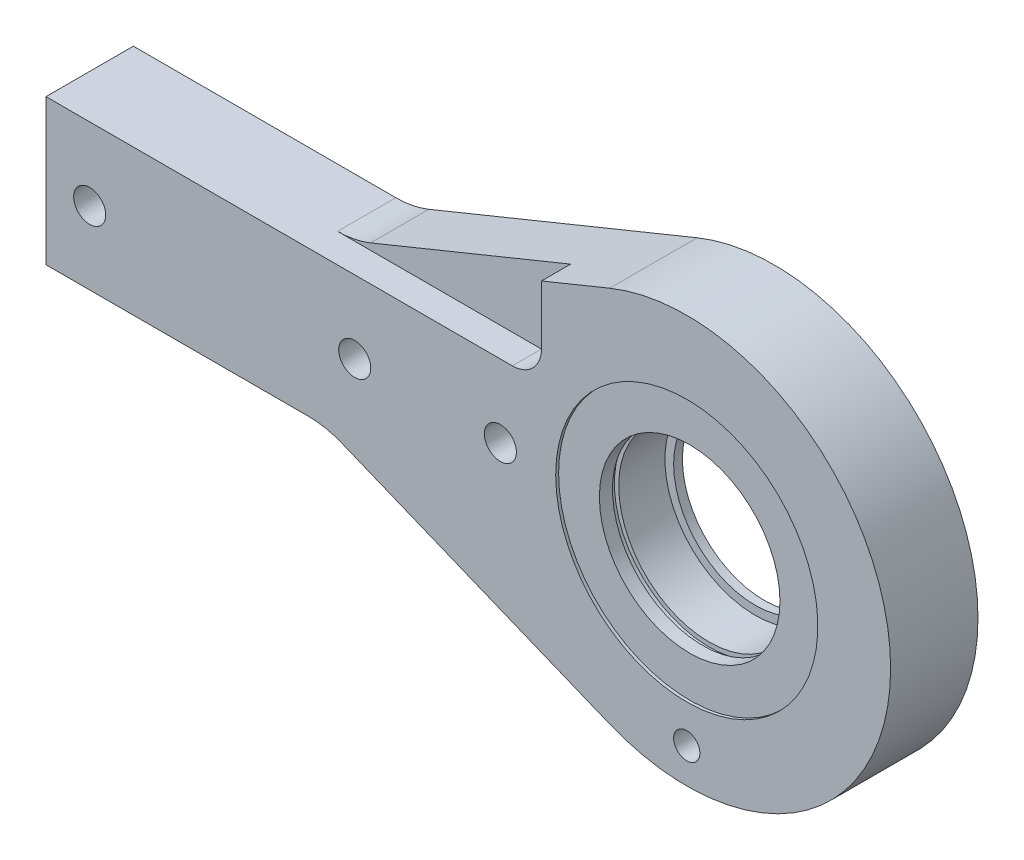
ISO-10303-21;
HEADER;
FILE_DESCRIPTION(('STEP AP214'),'2;1');
FILE_NAME('part.step','',(''),(''),'','','');
FILE_SCHEMA(('AUTOMOTIVE_DESIGN { 1 0 10303 214 1 1 1 1 }'));
ENDSEC;
DATA;
#1=APPLICATION_CONTEXT('core data for automotive mechanical design processes');
#2=APPLICATION_PROTOCOL_DEFINITION('international standard','automotive_design',2000,#1);
#3=PRODUCT_CONTEXT('',#1,'mechanical');
#4=PRODUCT('Part','Part','',(#3));
#5=PRODUCT_RELATED_PRODUCT_CATEGORY('part','',(#4));
#6=PRODUCT_DEFINITION_FORMATION('','',#4);
#7=PRODUCT_DEFINITION_CONTEXT('part definition',#1,'design');
#8=PRODUCT_DEFINITION('design','',#6,#7);
#9=PRODUCT_DEFINITION_SHAPE('','',#8);
#10=(LENGTH_UNIT() NAMED_UNIT(*) SI_UNIT(.MILLI.,.METRE.));
#11=(NAMED_UNIT(*) PLANE_ANGLE_UNIT() SI_UNIT($,.RADIAN.));
#12=(NAMED_UNIT(*) SI_UNIT($,.STERADIAN.) SOLID_ANGLE_UNIT());
#13=UNCERTAINTY_MEASURE_WITH_UNIT(LENGTH_MEASURE(1.E-05),#10,'distance_accuracy_value','');
#14=(GEOMETRIC_REPRESENTATION_CONTEXT(3) GLOBAL_UNCERTAINTY_ASSIGNED_CONTEXT((#13)) GLOBAL_UNIT_ASSIGNED_CONTEXT((#10,
#11,#12)) REPRESENTATION_CONTEXT('',''));
#15=CARTESIAN_POINT('',(0.,0.,0.));
#16=DIRECTION('',(0.,0.,1.));
#17=DIRECTION('',(1.,0.,0.));
#18=AXIS2_PLACEMENT_3D('',#15,#16,#17);
#19=CARTESIAN_POINT('',(-129.88591056475,55.,15.));
#20=DIRECTION('',(0.,0.,-1.));
#21=DIRECTION('',(-1.,0.,0.));
#22=AXIS2_PLACEMENT_3D('',#19,#20,#21);
#23=CYLINDRICAL_SURFACE('',#22,30.);
#24=CARTESIAN_POINT('',(-129.88591056475,55.,5.));
#25=DIRECTION('',(0.,0.,-1.));
#26=DIRECTION('',(1.,0.,0.));
#27=AXIS2_PLACEMENT_3D('',#24,#25,#26);
#28=CIRCLE('',#27,30.);
#29=CARTESIAN_POINT('',(-118.550429182882,27.2239876540691,5.));
#30=VERTEX_POINT('',#29);
#31=CARTESIAN_POINT('',(-129.885910564751,25.,5.));
#32=VERTEX_POINT('',#31);
#33=EDGE_CURVE('E159',#30,#32,#28,.T.);
#34=ORIENTED_EDGE('',*,*,#33,.F.);
#35=DIRECTION('',(0.,0.,-1.));
#36=VECTOR('',#35,1.);
#37=CARTESIAN_POINT('',(-118.550429182882,27.2239876540691,15.));
#38=LINE('',#37,#36);
#39=CARTESIAN_POINT('',(-118.550429182882,27.2239876540691,-15.));
#40=VERTEX_POINT('',#39);
#41=EDGE_CURVE('E155',#30,#40,#38,.T.);
#42=ORIENTED_EDGE('',*,*,#41,.T.);
#43=CARTESIAN_POINT('',(-129.88591056475,55.,-15.));
#44=DIRECTION('',(0.,0.,-1.));
#45=DIRECTION('',(1.,0.,0.));
#46=AXIS2_PLACEMENT_3D('',#43,#44,#45);
#47=CIRCLE('',#46,30.);
#48=CARTESIAN_POINT('',(-129.885910564751,25.,-15.));
#49=VERTEX_POINT('',#48);
#50=EDGE_CURVE('E265',#40,#49,#47,.T.);
#51=ORIENTED_EDGE('',*,*,#50,.T.);
#52=DIRECTION('',(0.,0.,-1.));
#53=VECTOR('',#52,1.);
#54=CARTESIAN_POINT('',(-129.885910564751,25.,15.));
#55=LINE('',#54,#53);
#56=EDGE_CURVE('E271',#32,#49,#55,.T.);
#57=ORIENTED_EDGE('',*,*,#56,.F.);
#58=EDGE_LOOP('',(#34,#42,#51,#57));
#59=FACE_BOUND('',#58,.T.);
#60=ADVANCED_FACE('F38',(#59),#23,.F.);
#61=CARTESIAN_POINT('',(0.,0.,15.));
#62=DIRECTION('',(0.,0.,-1.));
#63=DIRECTION('',(-1.,0.,0.));
#64=AXIS2_PLACEMENT_3D('',#61,#62,#63);
#65=CYLINDRICAL_SURFACE('',#64,28.);
#66=CARTESIAN_POINT('',(0.,0.,-8.5));
#67=DIRECTION('',(0.,0.,1.));
#68=DIRECTION('',(1.,0.,0.));
#69=AXIS2_PLACEMENT_3D('',#66,#67,#68);
#70=CIRCLE('',#69,28.);
#71=CARTESIAN_POINT('',(28.,0.,-8.5));
#72=VERTEX_POINT('',#71);
#73=EDGE_CURVE('E221',#72,#72,#70,.T.);
#74=ORIENTED_EDGE('',*,*,#73,.T.);
#75=EDGE_LOOP('',(#74));
#76=FACE_BOUND('',#75,.T.);
#77=CARTESIAN_POINT('',(0.,0.,-11.5));
#78=DIRECTION('',(0.,0.,-1.));
#79=DIRECTION('',(-1.,0.,0.));
#80=AXIS2_PLACEMENT_3D('',#77,#78,#79);
#81=CIRCLE('',#80,28.);
#82=CARTESIAN_POINT('',(-28.,0.,-11.5));
#83=VERTEX_POINT('',#82);
#84=EDGE_CURVE('E201',#83,#83,#81,.T.);
#85=ORIENTED_EDGE('',*,*,#84,.T.);
#86=EDGE_LOOP('',(#85));
#87=FACE_BOUND('',#86,.T.);
#88=ADVANCED_FACE('F382',(#76,#87),#65,.F.);
#89=CARTESIAN_POINT('',(-129.88591056475,-55.,15.));
#90=DIRECTION('',(0.,0.,1.));
#91=DIRECTION('',(1.,0.,0.));
#92=AXIS2_PLACEMENT_3D('',#89,#90,#91);
#93=PLANE('',#92);
#94=CARTESIAN_POINT('',(0.,-58.,15.));
#95=DIRECTION('',(0.,0.,-1.));
#96=DIRECTION('',(-1.,0.,0.));
#97=AXIS2_PLACEMENT_3D('',#94,#95,#96);
#98=CIRCLE('',#97,4.49999999999999);
#99=CARTESIAN_POINT('',(-4.49999999999999,-58.,15.));
#100=VERTEX_POINT('',#99);
#101=EDGE_CURVE('E331',#100,#100,#98,.T.);
#102=ORIENTED_EDGE('',*,*,#101,.T.);
#103=EDGE_LOOP('',(#102));
#104=FACE_BOUND('',#103,.T.);
#105=CARTESIAN_POINT('',(-64.,0.,15.));
#106=DIRECTION('',(0.,0.,-1.));
#107=DIRECTION('',(-1.,0.,0.));
#108=AXIS2_PLACEMENT_3D('',#105,#106,#107);
#109=CIRCLE('',#108,5.49999999999999);
#110=CARTESIAN_POINT('',(-69.5,0.,15.));
#111=VERTEX_POINT('',#110);
#112=EDGE_CURVE('E160',#111,#111,#109,.T.);
#113=ORIENTED_EDGE('',*,*,#112,.T.);
#114=EDGE_LOOP('',(#113));
#115=FACE_BOUND('',#114,.T.);
#116=DIRECTION('',(0.,1.,0.));
#117=VECTOR('',#116,1.);
#118=CARTESIAN_POINT('',(-49.8859105647505,25.,15.));
#119=LINE('',#118,#117);
#120=CARTESIAN_POINT('',(-49.8859105647505,35.,15.));
#121=VERTEX_POINT('',#120);
#122=CARTESIAN_POINT('',(-49.8859105647505,55.2462020272864,15.));
#123=VERTEX_POINT('',#122);
#124=EDGE_CURVE('E146',#121,#123,#119,.T.);
#125=ORIENTED_EDGE('',*,*,#124,.F.);
#126=CARTESIAN_POINT('',(-59.8859105647505,35.,15.));
#127=DIRECTION('',(0.,0.,1.));
#128=DIRECTION('',(1.,0.,0.));
#129=AXIS2_PLACEMENT_3D('',#126,#127,#128);
#130=CIRCLE('',#129,10.);
#131=CARTESIAN_POINT('',(-59.8859105647505,25.,15.));
#132=VERTEX_POINT('',#131);
#133=EDGE_CURVE('E11',#121,#132,#130,.F.);
#134=ORIENTED_EDGE('',*,*,#133,.T.);
#135=DIRECTION('',(-1.,0.,0.));
#136=VECTOR('',#135,1.);
#137=CARTESIAN_POINT('',(-220.,25.,15.));
#138=LINE('',#137,#136);
#139=CARTESIAN_POINT('',(-220.,25.,15.));
#140=VERTEX_POINT('',#139);
#141=EDGE_CURVE('E250',#132,#140,#138,.T.);
#142=ORIENTED_EDGE('',*,*,#141,.T.);
#143=DIRECTION('',(0.,-1.,0.));
#144=VECTOR('',#143,1.);
#145=CARTESIAN_POINT('',(-220.,25.,15.));
#146=LINE('',#145,#144);
#147=CARTESIAN_POINT('',(-220.,-25.,15.));
#148=VERTEX_POINT('',#147);
#149=EDGE_CURVE('E236',#140,#148,#146,.T.);
#150=ORIENTED_EDGE('',*,*,#149,.T.);
#151=DIRECTION('',(1.,0.,0.));
#152=VECTOR('',#151,1.);
#153=CARTESIAN_POINT('',(-220.,-25.,15.));
#154=LINE('',#153,#152);
#155=CARTESIAN_POINT('',(-129.885910564751,-25.,15.));
#156=VERTEX_POINT('',#155);
#157=EDGE_CURVE('E239',#148,#156,#154,.T.);
#158=ORIENTED_EDGE('',*,*,#157,.T.);
#159=CARTESIAN_POINT('',(-129.88591056475,-55.,15.));
#160=DIRECTION('',(0.,0.,-1.));
#161=DIRECTION('',(1.,0.,0.));
#162=AXIS2_PLACEMENT_3D('',#159,#160,#161);
#163=CIRCLE('',#162,30.);
#164=CARTESIAN_POINT('',(-118.550429182882,-27.2239876540691,15.));
#165=VERTEX_POINT('',#164);
#166=EDGE_CURVE('E242',#156,#165,#163,.T.);
#167=ORIENTED_EDGE('',*,*,#166,.T.);
#168=DIRECTION('',(0.925867078197697,-0.377849379395626,0.));
#169=VECTOR('',#168,1.);
#170=CARTESIAN_POINT('',(-118.550429182882,-27.2239876540691,15.));
#171=LINE('',#170,#169);
#172=CARTESIAN_POINT('',(-26.4494565576938,-64.8106954738388,15.));
#173=VERTEX_POINT('',#172);
#174=EDGE_CURVE('E244',#165,#173,#171,.T.);
#175=ORIENTED_EDGE('',*,*,#174,.T.);
#176=CARTESIAN_POINT('',(0.,0.,15.));
#177=DIRECTION('',(0.,0.,1.));
#178=DIRECTION('',(-1.,0.,0.));
#179=AXIS2_PLACEMENT_3D('',#176,#177,#178);
#180=CIRCLE('',#179,70.);
#181=CARTESIAN_POINT('',(-26.4494565576938,64.8106954738388,15.));
#182=VERTEX_POINT('',#181);
#183=EDGE_CURVE('E246',#173,#182,#180,.T.);
#184=ORIENTED_EDGE('',*,*,#183,.T.);
#185=DIRECTION('',(-0.925867078197697,-0.377849379395626,0.));
#186=VECTOR('',#185,1.);
#187=CARTESIAN_POINT('',(-118.550429182882,27.2239876540691,15.));
#188=LINE('',#187,#186);
#189=EDGE_CURVE('E248',#182,#123,#188,.T.);
#190=ORIENTED_EDGE('',*,*,#189,.T.);
#191=EDGE_LOOP('',(#125,#134,#142,#150,#158,#167,#175,#184,#190));
#192=FACE_BOUND('',#191,.T.);
#193=CARTESIAN_POINT('',(-114.,0.,15.));
#194=DIRECTION('',(0.,0.,1.));
#195=DIRECTION('',(1.,0.,0.));
#196=AXIS2_PLACEMENT_3D('',#193,#194,#195);
#197=CIRCLE('',#196,5.5);
#198=CARTESIAN_POINT('',(-108.5,0.,15.));
#199=VERTEX_POINT('',#198);
#200=EDGE_CURVE('E223',#199,#199,#197,.T.);
#201=ORIENTED_EDGE('',*,*,#200,.F.);
#202=EDGE_LOOP('',(#201));
#203=FACE_BOUND('',#202,.T.);
#204=CARTESIAN_POINT('',(-205.,0.,15.));
#205=DIRECTION('',(0.,0.,1.));
#206=DIRECTION('',(1.,0.,0.));
#207=AXIS2_PLACEMENT_3D('',#204,#205,#206);
#208=CIRCLE('',#207,5.50000000000002);
#209=CARTESIAN_POINT('',(-199.5,0.,15.));
#210=VERTEX_POINT('',#209);
#211=EDGE_CURVE('E230',#210,#210,#208,.T.);
#212=ORIENTED_EDGE('',*,*,#211,.F.);
#213=EDGE_LOOP('',(#212));
#214=FACE_BOUND('',#213,.T.);
#215=CARTESIAN_POINT('',(0.,0.,15.));
#216=DIRECTION('',(0.,0.,-1.));
#217=DIRECTION('',(-1.,0.,0.));
#218=AXIS2_PLACEMENT_3D('',#215,#216,#217);
#219=CIRCLE('',#218,45.);
#220=CARTESIAN_POINT('',(-45.,0.,15.));
#221=VERTEX_POINT('',#220);
#222=EDGE_CURVE('E208',#221,#221,#219,.T.);
#223=ORIENTED_EDGE('',*,*,#222,.T.);
#224=EDGE_LOOP('',(#223));
#225=FACE_BOUND('',#224,.T.);
#226=ADVANCED_FACE('F302',(#104,#115,#192,#203,#214,#225),#93,.T.);
#227=CARTESIAN_POINT('',(0.,0.,-8.5));
#228=DIRECTION('',(0.,0.,1.));
#229=DIRECTION('',(1.,0.,0.));
#230=AXIS2_PLACEMENT_3D('',#227,#228,#229);
#231=CYLINDRICAL_SURFACE('',#230,31.);
#232=CARTESIAN_POINT('',(0.,0.,14.));
#233=DIRECTION('',(0.,0.,-1.));
#234=DIRECTION('',(-1.,0.,0.));
#235=AXIS2_PLACEMENT_3D('',#232,#233,#234);
#236=CIRCLE('',#235,31.);
#237=CARTESIAN_POINT('',(-31.,0.,14.));
#238=VERTEX_POINT('',#237);
#239=EDGE_CURVE('E207',#238,#238,#236,.F.);
#240=ORIENTED_EDGE('',*,*,#239,.T.);
#241=EDGE_LOOP('',(#240));
#242=FACE_BOUND('',#241,.T.);
#243=CARTESIAN_POINT('',(0.,0.,9.5));
#244=DIRECTION('',(0.,0.,1.));
#245=DIRECTION('',(1.,0.,0.));
#246=AXIS2_PLACEMENT_3D('',#243,#244,#245);
#247=CIRCLE('',#246,31.);
#248=CARTESIAN_POINT('',(31.,0.,9.5));
#249=VERTEX_POINT('',#248);
#250=EDGE_CURVE('E222',#249,#249,#247,.F.);
#251=ORIENTED_EDGE('',*,*,#250,.T.);
#252=EDGE_LOOP('',(#251));
#253=FACE_BOUND('',#252,.T.);
#254=ADVANCED_FACE('F349',(#242,#253),#231,.F.);
#255=CARTESIAN_POINT('',(-129.88591056475,-55.,-15.));
#256=DIRECTION('',(0.,0.,1.));
#257=DIRECTION('',(1.,0.,0.));
#258=AXIS2_PLACEMENT_3D('',#255,#256,#257);
#259=PLANE('',#258);
#260=CARTESIAN_POINT('',(0.,-58.,-15.));
#261=DIRECTION('',(0.,0.,-1.));
#262=DIRECTION('',(-1.,0.,0.));
#263=AXIS2_PLACEMENT_3D('',#260,#261,#262);
#264=CIRCLE('',#263,7.5);
#265=CARTESIAN_POINT('',(-7.5,-58.,-15.));
#266=VERTEX_POINT('',#265);
#267=EDGE_CURVE('E340',#266,#266,#264,.T.);
#268=ORIENTED_EDGE('',*,*,#267,.F.);
#269=EDGE_LOOP('',(#268));
#270=FACE_BOUND('',#269,.T.);
#271=CARTESIAN_POINT('',(-64.,0.,-15.));
#272=DIRECTION('',(0.,0.,-1.));
#273=DIRECTION('',(-1.,0.,0.));
#274=AXIS2_PLACEMENT_3D('',#271,#272,#273);
#275=CIRCLE('',#274,8.99999999999999);
#276=CARTESIAN_POINT('',(-73.,0.,-15.));
#277=VERTEX_POINT('',#276);
#278=EDGE_CURVE('E328',#277,#277,#275,.T.);
#279=ORIENTED_EDGE('',*,*,#278,.F.);
#280=EDGE_LOOP('',(#279));
#281=FACE_BOUND('',#280,.T.);
#282=CARTESIAN_POINT('',(40.6586399182264,40.6586399182266,-15.));
#283=DIRECTION('',(0.,0.,-1.));
#284=DIRECTION('',(-1.,0.,0.));
#285=AXIS2_PLACEMENT_3D('',#282,#283,#284);
#286=CIRCLE('',#285,4.025);
#287=CARTESIAN_POINT('',(36.6336399182264,40.6586399182266,-15.));
#288=VERTEX_POINT('',#287);
#289=EDGE_CURVE('E150',#288,#288,#286,.T.);
#290=ORIENTED_EDGE('',*,*,#289,.F.);
#291=EDGE_LOOP('',(#290));
#292=FACE_BOUND('',#291,.T.);
#293=CARTESIAN_POINT('',(-40.6586399182264,40.6586399182266,-15.));
#294=DIRECTION('',(0.,0.,-1.));
#295=DIRECTION('',(-1.,0.,0.));
#296=AXIS2_PLACEMENT_3D('',#293,#294,#295);
#297=CIRCLE('',#296,4.025);
#298=CARTESIAN_POINT('',(-44.6836399182264,40.6586399182266,-15.));
#299=VERTEX_POINT('',#298);
#300=EDGE_CURVE('E170',#299,#299,#297,.T.);
#301=ORIENTED_EDGE('',*,*,#300,.F.);
#302=EDGE_LOOP('',(#301));
#303=FACE_BOUND('',#302,.T.);
#304=CARTESIAN_POINT('',(-40.6586399182264,-40.6586399182266,-15.));
#305=DIRECTION('',(0.,0.,-1.));
#306=DIRECTION('',(-1.,0.,0.));
#307=AXIS2_PLACEMENT_3D('',#304,#305,#306);
#308=CIRCLE('',#307,4.025);
#309=CARTESIAN_POINT('',(-44.6836399182264,-40.6586399182266,-15.));
#310=VERTEX_POINT('',#309);
#311=EDGE_CURVE('E179',#310,#310,#308,.T.);
#312=ORIENTED_EDGE('',*,*,#311,.F.);
#313=EDGE_LOOP('',(#312));
#314=FACE_BOUND('',#313,.T.);
#315=CARTESIAN_POINT('',(40.6586399182264,-40.6586399182266,-15.));
#316=DIRECTION('',(0.,0.,-1.));
#317=DIRECTION('',(-1.,0.,0.));
#318=AXIS2_PLACEMENT_3D('',#315,#316,#317);
#319=CIRCLE('',#318,4.025);
#320=CARTESIAN_POINT('',(36.6336399182264,-40.6586399182266,-15.));
#321=VERTEX_POINT('',#320);
#322=EDGE_CURVE('E188',#321,#321,#319,.T.);
#323=ORIENTED_EDGE('',*,*,#322,.F.);
#324=EDGE_LOOP('',(#323));
#325=FACE_BOUND('',#324,.T.);
#326=CARTESIAN_POINT('',(0.,0.,-15.));
#327=DIRECTION('',(0.,0.,-1.));
#328=DIRECTION('',(-1.,0.,0.));
#329=AXIS2_PLACEMENT_3D('',#326,#327,#328);
#330=CIRCLE('',#329,47.5);
#331=CARTESIAN_POINT('',(-47.5,0.,-15.));
#332=VERTEX_POINT('',#331);
#333=EDGE_CURVE('E197',#332,#332,#330,.T.);
#334=ORIENTED_EDGE('',*,*,#333,.F.);
#335=EDGE_LOOP('',(#334));
#336=FACE_BOUND('',#335,.T.);
#337=DIRECTION('',(0.,-1.,0.));
#338=VECTOR('',#337,1.);
#339=CARTESIAN_POINT('',(-220.,25.,-15.));
#340=LINE('',#339,#338);
#341=CARTESIAN_POINT('',(-220.,25.,-15.));
#342=VERTEX_POINT('',#341);
#343=CARTESIAN_POINT('',(-220.,-25.,-15.));
#344=VERTEX_POINT('',#343);
#345=EDGE_CURVE('E233',#342,#344,#340,.T.);
#346=ORIENTED_EDGE('',*,*,#345,.F.);
#347=DIRECTION('',(-1.,0.,0.));
#348=VECTOR('',#347,1.);
#349=CARTESIAN_POINT('',(-220.,25.,-15.));
#350=LINE('',#349,#348);
#351=EDGE_CURVE('E240',#49,#342,#350,.T.);
#352=ORIENTED_EDGE('',*,*,#351,.F.);
#353=ORIENTED_EDGE('',*,*,#50,.F.);
#354=DIRECTION('',(-0.925867078197697,-0.377849379395626,0.));
#355=VECTOR('',#354,1.);
#356=CARTESIAN_POINT('',(-118.550429182882,27.2239876540691,-15.));
#357=LINE('',#356,#355);
#358=CARTESIAN_POINT('',(-26.4494565576938,64.8106954738388,-15.));
#359=VERTEX_POINT('',#358);
#360=EDGE_CURVE('E263',#359,#40,#357,.T.);
#361=ORIENTED_EDGE('',*,*,#360,.F.);
#362=CARTESIAN_POINT('',(0.,0.,-15.));
#363=DIRECTION('',(0.,0.,1.));
#364=DIRECTION('',(-1.,0.,0.));
#365=AXIS2_PLACEMENT_3D('',#362,#363,#364);
#366=CIRCLE('',#365,70.);
#367=CARTESIAN_POINT('',(-26.4494565576938,-64.8106954738388,-15.));
#368=VERTEX_POINT('',#367);
#369=EDGE_CURVE('E261',#368,#359,#366,.T.);
#370=ORIENTED_EDGE('',*,*,#369,.F.);
#371=DIRECTION('',(0.925867078197697,-0.377849379395626,0.));
#372=VECTOR('',#371,1.);
#373=CARTESIAN_POINT('',(-118.550429182882,-27.2239876540691,-15.));
#374=LINE('',#373,#372);
#375=CARTESIAN_POINT('',(-118.550429182882,-27.2239876540691,-15.));
#376=VERTEX_POINT('',#375);
#377=EDGE_CURVE('E259',#376,#368,#374,.T.);
#378=ORIENTED_EDGE('',*,*,#377,.F.);
#379=CARTESIAN_POINT('',(-129.88591056475,-55.,-15.));
#380=DIRECTION('',(0.,0.,-1.));
#381=DIRECTION('',(1.,0.,0.));
#382=AXIS2_PLACEMENT_3D('',#379,#380,#381);
#383=CIRCLE('',#382,30.);
#384=CARTESIAN_POINT('',(-129.885910564751,-25.,-15.));
#385=VERTEX_POINT('',#384);
#386=EDGE_CURVE('E257',#385,#376,#383,.T.);
#387=ORIENTED_EDGE('',*,*,#386,.F.);
#388=DIRECTION('',(1.,0.,0.));
#389=VECTOR('',#388,1.);
#390=CARTESIAN_POINT('',(-220.,-25.,-15.));
#391=LINE('',#390,#389);
#392=EDGE_CURVE('E255',#344,#385,#391,.T.);
#393=ORIENTED_EDGE('',*,*,#392,.F.);
#394=EDGE_LOOP('',(#346,#352,#353,#361,#370,#378,#387,#393));
#395=FACE_BOUND('',#394,.T.);
#396=CARTESIAN_POINT('',(-205.,0.,-15.));
#397=DIRECTION('',(0.,0.,1.));
#398=DIRECTION('',(1.,0.,0.));
#399=AXIS2_PLACEMENT_3D('',#396,#397,#398);
#400=CIRCLE('',#399,5.50000000000002);
#401=CARTESIAN_POINT('',(-199.5,0.,-15.));
#402=VERTEX_POINT('',#401);
#403=EDGE_CURVE('E226',#402,#402,#400,.T.);
#404=ORIENTED_EDGE('',*,*,#403,.T.);
#405=EDGE_LOOP('',(#404));
#406=FACE_BOUND('',#405,.T.);
#407=CARTESIAN_POINT('',(-114.,0.,-15.));
#408=DIRECTION('',(0.,0.,1.));
#409=DIRECTION('',(1.,0.,0.));
#410=AXIS2_PLACEMENT_3D('',#407,#408,#409);
#411=CIRCLE('',#410,5.5);
#412=CARTESIAN_POINT('',(-108.5,0.,-15.));
#413=VERTEX_POINT('',#412);
#414=EDGE_CURVE('E227',#413,#413,#411,.T.);
#415=ORIENTED_EDGE('',*,*,#414,.T.);
#416=EDGE_LOOP('',(#415));
#417=FACE_BOUND('',#416,.T.);
#418=ADVANCED_FACE('F312',(#270,#281,#292,#303,#314,#325,#336,#395,#406,#417),#259,.F.);
#419=CARTESIAN_POINT('',(-220.,25.,15.));
#420=DIRECTION('',(1.,0.,0.));
#421=DIRECTION('',(0.,0.,-1.));
#422=AXIS2_PLACEMENT_3D('',#419,#420,#421);
#423=PLANE('',#422);
#424=ORIENTED_EDGE('',*,*,#345,.T.);
#425=DIRECTION('',(0.,0.,-1.));
#426=VECTOR('',#425,1.);
#427=CARTESIAN_POINT('',(-220.,-25.,15.));
#428=LINE('',#427,#426);
#429=EDGE_CURVE('E286',#148,#344,#428,.T.);
#430=ORIENTED_EDGE('',*,*,#429,.F.);
#431=ORIENTED_EDGE('',*,*,#149,.F.);
#432=DIRECTION('',(0.,0.,-1.));
#433=VECTOR('',#432,1.);
#434=CARTESIAN_POINT('',(-220.,25.,15.));
#435=LINE('',#434,#433);
#436=EDGE_CURVE('E252',#140,#342,#435,.T.);
#437=ORIENTED_EDGE('',*,*,#436,.T.);
#438=EDGE_LOOP('',(#424,#430,#431,#437));
#439=FACE_BOUND('',#438,.T.);
#440=ADVANCED_FACE('F348',(#439),#423,.F.);
#441=CARTESIAN_POINT('',(-220.,-25.,15.));
#442=DIRECTION('',(0.,1.,0.));
#443=DIRECTION('',(0.,0.,1.));
#444=AXIS2_PLACEMENT_3D('',#441,#442,#443);
#445=PLANE('',#444);
#446=ORIENTED_EDGE('',*,*,#392,.T.);
#447=DIRECTION('',(0.,0.,-1.));
#448=VECTOR('',#447,1.);
#449=CARTESIAN_POINT('',(-129.885910564751,-25.,15.));
#450=LINE('',#449,#448);
#451=EDGE_CURVE('E283',#156,#385,#450,.T.);
#452=ORIENTED_EDGE('',*,*,#451,.F.);
#453=ORIENTED_EDGE('',*,*,#157,.F.);
#454=ORIENTED_EDGE('',*,*,#429,.T.);
#455=EDGE_LOOP('',(#446,#452,#453,#454));
#456=FACE_BOUND('',#455,.T.);
#457=ADVANCED_FACE('F404',(#456),#445,.F.);
#458=CARTESIAN_POINT('',(-129.88591056475,-55.,15.));
#459=DIRECTION('',(0.,0.,-1.));
#460=DIRECTION('',(-1.,0.,0.));
#461=AXIS2_PLACEMENT_3D('',#458,#459,#460);
#462=CYLINDRICAL_SURFACE('',#461,30.);
#463=ORIENTED_EDGE('',*,*,#386,.T.);
#464=DIRECTION('',(0.,0.,-1.));
#465=VECTOR('',#464,1.);
#466=CARTESIAN_POINT('',(-118.550429182882,-27.2239876540691,15.));
#467=LINE('',#466,#465);
#468=EDGE_CURVE('E280',#165,#376,#467,.T.);
#469=ORIENTED_EDGE('',*,*,#468,.F.);
#470=ORIENTED_EDGE('',*,*,#166,.F.);
#471=ORIENTED_EDGE('',*,*,#451,.T.);
#472=EDGE_LOOP('',(#463,#469,#470,#471));
#473=FACE_BOUND('',#472,.T.);
#474=ADVANCED_FACE('F400',(#473),#462,.F.);
#475=CARTESIAN_POINT('',(-118.550429182882,-27.2239876540691,15.));
#476=DIRECTION('',(0.377849379395626,0.925867078197697,0.));
#477=DIRECTION('',(-0.925867078197697,0.377849379395626,0.));
#478=AXIS2_PLACEMENT_3D('',#475,#476,#477);
#479=PLANE('',#478);
#480=ORIENTED_EDGE('',*,*,#377,.T.);
#481=DIRECTION('',(0.,0.,-1.));
#482=VECTOR('',#481,1.);
#483=CARTESIAN_POINT('',(-26.4494565576938,-64.8106954738388,15.));
#484=LINE('',#483,#482);
#485=EDGE_CURVE('E277',#173,#368,#484,.T.);
#486=ORIENTED_EDGE('',*,*,#485,.F.);
#487=ORIENTED_EDGE('',*,*,#174,.F.);
#488=ORIENTED_EDGE('',*,*,#468,.T.);
#489=EDGE_LOOP('',(#480,#486,#487,#488));
#490=FACE_BOUND('',#489,.T.);
#491=ADVANCED_FACE('F397',(#490),#479,.F.);
#492=CARTESIAN_POINT('',(0.,0.,15.));
#493=DIRECTION('',(0.,0.,-1.));
#494=DIRECTION('',(-1.,0.,0.));
#495=AXIS2_PLACEMENT_3D('',#492,#493,#494);
#496=CYLINDRICAL_SURFACE('',#495,70.);
#497=ORIENTED_EDGE('',*,*,#369,.T.);
#498=DIRECTION('',(0.,0.,-1.));
#499=VECTOR('',#498,1.);
#500=CARTESIAN_POINT('',(-26.4494565576938,64.8106954738388,15.));
#501=LINE('',#500,#499);
#502=EDGE_CURVE('E274',#182,#359,#501,.T.);
#503=ORIENTED_EDGE('',*,*,#502,.F.);
#504=ORIENTED_EDGE('',*,*,#183,.F.);
#505=ORIENTED_EDGE('',*,*,#485,.T.);
#506=EDGE_LOOP('',(#497,#503,#504,#505));
#507=FACE_BOUND('',#506,.T.);
#508=ADVANCED_FACE('F394',(#507),#496,.T.);
#509=CARTESIAN_POINT('',(-118.550429182882,27.2239876540691,15.));
#510=DIRECTION('',(0.377849379395626,-0.925867078197697,0.));
#511=DIRECTION('',(0.925867078197697,0.377849379395626,0.));
#512=AXIS2_PLACEMENT_3D('',#509,#510,#511);
#513=PLANE('',#512);
#514=DIRECTION('',(-0.925867078197697,-0.377849379395626,0.));
#515=VECTOR('',#514,1.);
#516=CARTESIAN_POINT('',(-49.8859105647505,55.2462020272864,5.));
#517=LINE('',#516,#515);
#518=CARTESIAN_POINT('',(-49.8859105647505,55.2462020272864,5.));
#519=VERTEX_POINT('',#518);
#520=EDGE_CURVE('E135',#519,#30,#517,.T.);
#521=ORIENTED_EDGE('',*,*,#520,.F.);
#522=DIRECTION('',(0.,0.,1.));
#523=VECTOR('',#522,1.);
#524=CARTESIAN_POINT('',(-49.8859105647505,55.2462020272864,5.));
#525=LINE('',#524,#523);
#526=EDGE_CURVE('E144',#519,#123,#525,.T.);
#527=ORIENTED_EDGE('',*,*,#526,.T.);
#528=ORIENTED_EDGE('',*,*,#189,.F.);
#529=ORIENTED_EDGE('',*,*,#502,.T.);
#530=ORIENTED_EDGE('',*,*,#360,.T.);
#531=ORIENTED_EDGE('',*,*,#41,.F.);
#532=EDGE_LOOP('',(#521,#527,#528,#529,#530,#531));
#533=FACE_BOUND('',#532,.T.);
#534=ADVANCED_FACE('F153',(#533),#513,.F.);
#535=CARTESIAN_POINT('',(-220.,25.,15.));
#536=DIRECTION('',(0.,-1.,0.));
#537=DIRECTION('',(0.,0.,-1.));
#538=AXIS2_PLACEMENT_3D('',#535,#536,#537);
#539=PLANE('',#538);
#540=ORIENTED_EDGE('',*,*,#141,.F.);
#541=DIRECTION('',(0.,0.,1.));
#542=VECTOR('',#541,1.);
#543=CARTESIAN_POINT('',(-59.8859105647505,25.,5.));
#544=LINE('',#543,#542);
#545=CARTESIAN_POINT('',(-59.8859105647505,25.,5.));
#546=VERTEX_POINT('',#545);
#547=EDGE_CURVE('E53',#132,#546,#544,.F.);
#548=ORIENTED_EDGE('',*,*,#547,.T.);
#549=DIRECTION('',(1.,0.,0.));
#550=VECTOR('',#549,1.);
#551=CARTESIAN_POINT('',(-129.885910564751,25.,5.));
#552=LINE('',#551,#550);
#553=EDGE_CURVE('E141',#32,#546,#552,.T.);
#554=ORIENTED_EDGE('',*,*,#553,.F.);
#555=ORIENTED_EDGE('',*,*,#56,.T.);
#556=ORIENTED_EDGE('',*,*,#351,.T.);
#557=ORIENTED_EDGE('',*,*,#436,.F.);
#558=EDGE_LOOP('',(#540,#548,#554,#555,#556,#557));
#559=FACE_BOUND('',#558,.T.);
#560=ADVANCED_FACE('F391',(#559),#539,.F.);
#561=CARTESIAN_POINT('',(-205.,0.,15.));
#562=DIRECTION('',(0.,0.,-1.));
#563=DIRECTION('',(-1.,0.,0.));
#564=AXIS2_PLACEMENT_3D('',#561,#562,#563);
#565=CYLINDRICAL_SURFACE('',#564,5.50000000000002);
#566=ORIENTED_EDGE('',*,*,#211,.T.);
#567=EDGE_LOOP('',(#566));
#568=FACE_BOUND('',#567,.T.);
#569=ORIENTED_EDGE('',*,*,#403,.F.);
#570=EDGE_LOOP('',(#569));
#571=FACE_BOUND('',#570,.T.);
#572=ADVANCED_FACE('F724',(#568,#571),#565,.F.);
#573=CARTESIAN_POINT('',(-114.,0.,15.));
#574=DIRECTION('',(0.,0.,-1.));
#575=DIRECTION('',(-1.,0.,0.));
#576=AXIS2_PLACEMENT_3D('',#573,#574,#575);
#577=CYLINDRICAL_SURFACE('',#576,5.5);
#578=ORIENTED_EDGE('',*,*,#200,.T.);
#579=EDGE_LOOP('',(#578));
#580=FACE_BOUND('',#579,.T.);
#581=ORIENTED_EDGE('',*,*,#414,.F.);
#582=EDGE_LOOP('',(#581));
#583=FACE_BOUND('',#582,.T.);
#584=ADVANCED_FACE('F737',(#580,#583),#577,.F.);
#585=CARTESIAN_POINT('',(0.,0.,7.35));
#586=DIRECTION('',(0.,0.,-1.));
#587=DIRECTION('',(-1.,0.,0.));
#588=AXIS2_PLACEMENT_3D('',#585,#586,#587);
#589=CIRCLE('',#588,31.);
#590=CARTESIAN_POINT('',(-31.,0.,7.35));
#591=VERTEX_POINT('',#590);
#592=EDGE_CURVE('E217',#591,#591,#589,.F.);
#593=ORIENTED_EDGE('',*,*,#592,.T.);
#594=EDGE_LOOP('',(#593));
#595=FACE_BOUND('',#594,.T.);
#596=CARTESIAN_POINT('',(0.,0.,-8.5));
#597=DIRECTION('',(0.,0.,1.));
#598=DIRECTION('',(1.,0.,0.));
#599=AXIS2_PLACEMENT_3D('',#596,#597,#598);
#600=CIRCLE('',#599,31.);
#601=CARTESIAN_POINT('',(31.,0.,-8.5));
#602=VERTEX_POINT('',#601);
#603=EDGE_CURVE('E218',#602,#602,#600,.T.);
#604=ORIENTED_EDGE('',*,*,#603,.F.);
#605=EDGE_LOOP('',(#604));
#606=FACE_BOUND('',#605,.T.);
#607=ADVANCED_FACE('F646',(#595,#606),#231,.F.);
#608=CARTESIAN_POINT('',(0.,0.,-8.5));
#609=DIRECTION('',(0.,0.,1.));
#610=DIRECTION('',(1.,0.,0.));
#611=AXIS2_PLACEMENT_3D('',#608,#609,#610);
#612=PLANE('',#611);
#613=ORIENTED_EDGE('',*,*,#73,.F.);
#614=EDGE_LOOP('',(#613));
#615=FACE_BOUND('',#614,.T.);
#616=ORIENTED_EDGE('',*,*,#603,.T.);
#617=EDGE_LOOP('',(#616));
#618=FACE_BOUND('',#617,.T.);
#619=ADVANCED_FACE('F755',(#615,#618),#612,.T.);
#620=CARTESIAN_POINT('',(23.,0.,9.5));
#621=DIRECTION('',(0.,0.,1.));
#622=DIRECTION('',(1.,0.,0.));
#623=AXIS2_PLACEMENT_3D('',#620,#621,#622);
#624=PLANE('',#623);
#625=CARTESIAN_POINT('',(0.,0.,9.5));
#626=DIRECTION('',(0.,0.,1.));
#627=DIRECTION('',(1.,0.,0.));
#628=AXIS2_PLACEMENT_3D('',#625,#626,#627);
#629=CIRCLE('',#628,32.5);
#630=CARTESIAN_POINT('',(32.5,0.,9.5));
#631=VERTEX_POINT('',#630);
#632=EDGE_CURVE('E214',#631,#631,#629,.T.);
#633=ORIENTED_EDGE('',*,*,#632,.F.);
#634=EDGE_LOOP('',(#633));
#635=FACE_BOUND('',#634,.T.);
#636=ORIENTED_EDGE('',*,*,#250,.F.);
#637=EDGE_LOOP('',(#636));
#638=FACE_BOUND('',#637,.T.);
#639=ADVANCED_FACE('F762',(#635,#638),#624,.F.);
#640=CARTESIAN_POINT('',(23.,0.,7.35));
#641=DIRECTION('',(0.,0.,-1.));
#642=DIRECTION('',(-1.,0.,0.));
#643=AXIS2_PLACEMENT_3D('',#640,#641,#642);
#644=PLANE('',#643);
#645=CARTESIAN_POINT('',(0.,0.,7.35));
#646=DIRECTION('',(0.,0.,1.));
#647=DIRECTION('',(1.,0.,0.));
#648=AXIS2_PLACEMENT_3D('',#645,#646,#647);
#649=CIRCLE('',#648,32.5);
#650=CARTESIAN_POINT('',(32.5,0.,7.35));
#651=VERTEX_POINT('',#650);
#652=EDGE_CURVE('E211',#651,#651,#649,.T.);
#653=ORIENTED_EDGE('',*,*,#652,.T.);
#654=EDGE_LOOP('',(#653));
#655=FACE_BOUND('',#654,.T.);
#656=ORIENTED_EDGE('',*,*,#592,.F.);
#657=EDGE_LOOP('',(#656));
#658=FACE_BOUND('',#657,.T.);
#659=ADVANCED_FACE('F771',(#655,#658),#644,.F.);
#660=CARTESIAN_POINT('',(0.,0.,0.));
#661=DIRECTION('',(0.,0.,1.));
#662=DIRECTION('',(1.,0.,0.));
#663=AXIS2_PLACEMENT_3D('',#660,#661,#662);
#664=CYLINDRICAL_SURFACE('',#663,32.5);
#665=ORIENTED_EDGE('',*,*,#652,.F.);
#666=EDGE_LOOP('',(#665));
#667=FACE_BOUND('',#666,.T.);
#668=ORIENTED_EDGE('',*,*,#632,.T.);
#669=EDGE_LOOP('',(#668));
#670=FACE_BOUND('',#669,.T.);
#671=ADVANCED_FACE('F655',(#667,#670),#664,.F.);
#672=CARTESIAN_POINT('',(0.,0.,14.));
#673=DIRECTION('',(0.,0.,-1.));
#674=DIRECTION('',(-1.,0.,0.));
#675=AXIS2_PLACEMENT_3D('',#672,#673,#674);
#676=PLANE('',#675);
#677=CARTESIAN_POINT('',(0.,0.,14.));
#678=DIRECTION('',(0.,0.,-1.));
#679=DIRECTION('',(-1.,0.,0.));
#680=AXIS2_PLACEMENT_3D('',#677,#678,#679);
#681=CIRCLE('',#680,45.);
#682=CARTESIAN_POINT('',(-45.,0.,14.));
#683=VERTEX_POINT('',#682);
#684=EDGE_CURVE('E204',#683,#683,#681,.T.);
#685=ORIENTED_EDGE('',*,*,#684,.F.);
#686=EDGE_LOOP('',(#685));
#687=FACE_BOUND('',#686,.T.);
#688=ORIENTED_EDGE('',*,*,#239,.F.);
#689=EDGE_LOOP('',(#688));
#690=FACE_BOUND('',#689,.T.);
#691=ADVANCED_FACE('F376',(#687,#690),#676,.F.);
#692=CARTESIAN_POINT('',(0.,0.,14.));
#693=DIRECTION('',(0.,0.,1.));
#694=DIRECTION('',(1.,0.,0.));
#695=AXIS2_PLACEMENT_3D('',#692,#693,#694);
#696=CYLINDRICAL_SURFACE('',#695,45.);
#697=ORIENTED_EDGE('',*,*,#684,.T.);
#698=EDGE_LOOP('',(#697));
#699=FACE_BOUND('',#698,.T.);
#700=ORIENTED_EDGE('',*,*,#222,.F.);
#701=EDGE_LOOP('',(#700));
#702=FACE_BOUND('',#701,.T.);
#703=ADVANCED_FACE('F366',(#699,#702),#696,.F.);
#704=CARTESIAN_POINT('',(0.,0.,-11.5));
#705=DIRECTION('',(0.,0.,-1.));
#706=DIRECTION('',(-1.,0.,0.));
#707=AXIS2_PLACEMENT_3D('',#704,#705,#706);
#708=CYLINDRICAL_SURFACE('',#707,47.5);
#709=CARTESIAN_POINT('',(0.,0.,-11.5));
#710=DIRECTION('',(0.,0.,-1.));
#711=DIRECTION('',(-1.,0.,0.));
#712=AXIS2_PLACEMENT_3D('',#709,#710,#711);
#713=CIRCLE('',#712,47.5);
#714=CARTESIAN_POINT('',(-47.5,0.,-11.5));
#715=VERTEX_POINT('',#714);
#716=EDGE_CURVE('E198',#715,#715,#713,.T.);
#717=ORIENTED_EDGE('',*,*,#716,.F.);
#718=EDGE_LOOP('',(#717));
#719=FACE_BOUND('',#718,.T.);
#720=ORIENTED_EDGE('',*,*,#333,.T.);
#721=EDGE_LOOP('',(#720));
#722=FACE_BOUND('',#721,.T.);
#723=ADVANCED_FACE('F363',(#719,#722),#708,.F.);
#724=CARTESIAN_POINT('',(0.,0.,-11.5));
#725=DIRECTION('',(0.,0.,-1.));
#726=DIRECTION('',(-1.,0.,0.));
#727=AXIS2_PLACEMENT_3D('',#724,#725,#726);
#728=PLANE('',#727);
#729=ORIENTED_EDGE('',*,*,#84,.F.);
#730=EDGE_LOOP('',(#729));
#731=FACE_BOUND('',#730,.T.);
#732=ORIENTED_EDGE('',*,*,#716,.T.);
#733=EDGE_LOOP('',(#732));
#734=FACE_BOUND('',#733,.T.);
#735=ADVANCED_FACE('F365',(#731,#734),#728,.T.);
#736=CARTESIAN_POINT('',(40.6586399182264,-40.6586399182266,2.5));
#737=DIRECTION('',(0.,0.,-1.));
#738=DIRECTION('',(-1.,0.,0.));
#739=AXIS2_PLACEMENT_3D('',#736,#737,#738);
#740=CONICAL_SURFACE('',#739,3.39999999999999,1.02974425867665);
#741=CARTESIAN_POINT('',(40.6586399182264,-40.6586399182266,4.54292610469371));
#742=VERTEX_POINT('',#741);
#743=VERTEX_LOOP('',#742);
#744=FACE_BOUND('',#743,.T.);
#745=CARTESIAN_POINT('',(40.6586399182264,-40.6586399182266,2.5));
#746=DIRECTION('',(0.,0.,-1.));
#747=DIRECTION('',(-1.,0.,0.));
#748=AXIS2_PLACEMENT_3D('',#745,#746,#747);
#749=CIRCLE('',#748,3.39999999999999);
#750=CARTESIAN_POINT('',(37.2586399182264,-40.6586399182266,2.5));
#751=VERTEX_POINT('',#750);
#752=EDGE_CURVE('E194',#751,#751,#749,.T.);
#753=ORIENTED_EDGE('',*,*,#752,.T.);
#754=EDGE_LOOP('',(#753));
#755=FACE_BOUND('',#754,.T.);
#756=ADVANCED_FACE('F373',(#744,#755),#740,.F.);
#757=CARTESIAN_POINT('',(40.6586399182264,-40.6586399182266,-15.));
#758=DIRECTION('',(0.,0.,-1.));
#759=DIRECTION('',(-1.,0.,0.));
#760=AXIS2_PLACEMENT_3D('',#757,#758,#759);
#761=CYLINDRICAL_SURFACE('',#760,3.4);
#762=ORIENTED_EDGE('',*,*,#752,.F.);
#763=EDGE_LOOP('',(#762));
#764=FACE_BOUND('',#763,.T.);
#765=CARTESIAN_POINT('',(40.6586399182264,-40.6586399182266,-14.375));
#766=DIRECTION('',(0.,0.,-1.));
#767=DIRECTION('',(-1.,0.,0.));
#768=AXIS2_PLACEMENT_3D('',#765,#766,#767);
#769=CIRCLE('',#768,3.4);
#770=CARTESIAN_POINT('',(37.2586399182264,-40.6586399182266,-14.375));
#771=VERTEX_POINT('',#770);
#772=EDGE_CURVE('E191',#771,#771,#769,.T.);
#773=ORIENTED_EDGE('',*,*,#772,.T.);
#774=EDGE_LOOP('',(#773));
#775=FACE_BOUND('',#774,.T.);
#776=ADVANCED_FACE('F473',(#764,#775),#761,.F.);
#777=CARTESIAN_POINT('',(40.6586399182264,-40.6586399182266,-15.));
#778=DIRECTION('',(0.,0.,-1.));
#779=DIRECTION('',(-1.,0.,0.));
#780=AXIS2_PLACEMENT_3D('',#777,#778,#779);
#781=CONICAL_SURFACE('',#780,4.025,0.785398163397446);
#782=ORIENTED_EDGE('',*,*,#772,.F.);
#783=EDGE_LOOP('',(#782));
#784=FACE_BOUND('',#783,.T.);
#785=ORIENTED_EDGE('',*,*,#322,.T.);
#786=EDGE_LOOP('',(#785));
#787=FACE_BOUND('',#786,.T.);
#788=ADVANCED_FACE('F469',(#784,#787),#781,.F.);
#789=CARTESIAN_POINT('',(-40.6586399182264,-40.6586399182266,2.5));
#790=DIRECTION('',(0.,0.,-1.));
#791=DIRECTION('',(-1.,0.,0.));
#792=AXIS2_PLACEMENT_3D('',#789,#790,#791);
#793=CONICAL_SURFACE('',#792,3.39999999999999,1.02974425867665);
#794=CARTESIAN_POINT('',(-40.6586399182264,-40.6586399182266,4.54292610469371));
#795=VERTEX_POINT('',#794);
#796=VERTEX_LOOP('',#795);
#797=FACE_BOUND('',#796,.T.);
#798=CARTESIAN_POINT('',(-40.6586399182264,-40.6586399182266,2.5));
#799=DIRECTION('',(0.,0.,-1.));
#800=DIRECTION('',(-1.,0.,0.));
#801=AXIS2_PLACEMENT_3D('',#798,#799,#800);
#802=CIRCLE('',#801,3.39999999999999);
#803=CARTESIAN_POINT('',(-44.0586399182264,-40.6586399182266,2.5));
#804=VERTEX_POINT('',#803);
#805=EDGE_CURVE('E185',#804,#804,#802,.T.);
#806=ORIENTED_EDGE('',*,*,#805,.T.);
#807=EDGE_LOOP('',(#806));
#808=FACE_BOUND('',#807,.T.);
#809=ADVANCED_FACE('F465',(#797,#808),#793,.F.);
#810=CARTESIAN_POINT('',(-40.6586399182264,-40.6586399182266,-15.));
#811=DIRECTION('',(0.,0.,-1.));
#812=DIRECTION('',(-1.,0.,0.));
#813=AXIS2_PLACEMENT_3D('',#810,#811,#812);
#814=CYLINDRICAL_SURFACE('',#813,3.4);
#815=ORIENTED_EDGE('',*,*,#805,.F.);
#816=EDGE_LOOP('',(#815));
#817=FACE_BOUND('',#816,.T.);
#818=CARTESIAN_POINT('',(-40.6586399182264,-40.6586399182266,-14.375));
#819=DIRECTION('',(0.,0.,-1.));
#820=DIRECTION('',(-1.,0.,0.));
#821=AXIS2_PLACEMENT_3D('',#818,#819,#820);
#822=CIRCLE('',#821,3.4);
#823=CARTESIAN_POINT('',(-44.0586399182264,-40.6586399182266,-14.375));
#824=VERTEX_POINT('',#823);
#825=EDGE_CURVE('E182',#824,#824,#822,.T.);
#826=ORIENTED_EDGE('',*,*,#825,.T.);
#827=EDGE_LOOP('',(#826));
#828=FACE_BOUND('',#827,.T.);
#829=ADVANCED_FACE('F461',(#817,#828),#814,.F.);
#830=CARTESIAN_POINT('',(-40.6586399182264,-40.6586399182266,-15.));
#831=DIRECTION('',(0.,0.,-1.));
#832=DIRECTION('',(-1.,0.,0.));
#833=AXIS2_PLACEMENT_3D('',#830,#831,#832);
#834=CONICAL_SURFACE('',#833,4.025,0.785398163397446);
#835=ORIENTED_EDGE('',*,*,#825,.F.);
#836=EDGE_LOOP('',(#835));
#837=FACE_BOUND('',#836,.T.);
#838=ORIENTED_EDGE('',*,*,#311,.T.);
#839=EDGE_LOOP('',(#838));
#840=FACE_BOUND('',#839,.T.);
#841=ADVANCED_FACE('F457',(#837,#840),#834,.F.);
#842=CARTESIAN_POINT('',(-40.6586399182264,40.6586399182266,2.5));
#843=DIRECTION('',(0.,0.,-1.));
#844=DIRECTION('',(-1.,0.,0.));
#845=AXIS2_PLACEMENT_3D('',#842,#843,#844);
#846=CONICAL_SURFACE('',#845,3.39999999999999,1.02974425867665);
#847=CARTESIAN_POINT('',(-40.6586399182264,40.6586399182266,4.54292610469371));
#848=VERTEX_POINT('',#847);
#849=VERTEX_LOOP('',#848);
#850=FACE_BOUND('',#849,.T.);
#851=CARTESIAN_POINT('',(-40.6586399182264,40.6586399182266,2.5));
#852=DIRECTION('',(0.,0.,-1.));
#853=DIRECTION('',(-1.,0.,0.));
#854=AXIS2_PLACEMENT_3D('',#851,#852,#853);
#855=CIRCLE('',#854,3.39999999999999);
#856=CARTESIAN_POINT('',(-44.0586399182264,40.6586399182266,2.5));
#857=VERTEX_POINT('',#856);
#858=EDGE_CURVE('E176',#857,#857,#855,.T.);
#859=ORIENTED_EDGE('',*,*,#858,.T.);
#860=EDGE_LOOP('',(#859));
#861=FACE_BOUND('',#860,.T.);
#862=ADVANCED_FACE('F453',(#850,#861),#846,.F.);
#863=CARTESIAN_POINT('',(-40.6586399182264,40.6586399182266,-15.));
#864=DIRECTION('',(0.,0.,-1.));
#865=DIRECTION('',(-1.,0.,0.));
#866=AXIS2_PLACEMENT_3D('',#863,#864,#865);
#867=CYLINDRICAL_SURFACE('',#866,3.4);
#868=ORIENTED_EDGE('',*,*,#858,.F.);
#869=EDGE_LOOP('',(#868));
#870=FACE_BOUND('',#869,.T.);
#871=CARTESIAN_POINT('',(-40.6586399182264,40.6586399182266,-14.375));
#872=DIRECTION('',(0.,0.,-1.));
#873=DIRECTION('',(-1.,0.,0.));
#874=AXIS2_PLACEMENT_3D('',#871,#872,#873);
#875=CIRCLE('',#874,3.4);
#876=CARTESIAN_POINT('',(-44.0586399182264,40.6586399182266,-14.375));
#877=VERTEX_POINT('',#876);
#878=EDGE_CURVE('E173',#877,#877,#875,.T.);
#879=ORIENTED_EDGE('',*,*,#878,.T.);
#880=EDGE_LOOP('',(#879));
#881=FACE_BOUND('',#880,.T.);
#882=ADVANCED_FACE('F449',(#870,#881),#867,.F.);
#883=CARTESIAN_POINT('',(-40.6586399182264,40.6586399182266,-15.));
#884=DIRECTION('',(0.,0.,-1.));
#885=DIRECTION('',(-1.,0.,0.));
#886=AXIS2_PLACEMENT_3D('',#883,#884,#885);
#887=CONICAL_SURFACE('',#886,4.025,0.785398163397446);
#888=ORIENTED_EDGE('',*,*,#878,.F.);
#889=EDGE_LOOP('',(#888));
#890=FACE_BOUND('',#889,.T.);
#891=ORIENTED_EDGE('',*,*,#300,.T.);
#892=EDGE_LOOP('',(#891));
#893=FACE_BOUND('',#892,.T.);
#894=ADVANCED_FACE('F445',(#890,#893),#887,.F.);
#895=CARTESIAN_POINT('',(40.6586399182264,40.6586399182266,2.5));
#896=DIRECTION('',(0.,0.,-1.));
#897=DIRECTION('',(-1.,0.,0.));
#898=AXIS2_PLACEMENT_3D('',#895,#896,#897);
#899=CONICAL_SURFACE('',#898,3.39999999999999,1.02974425867665);
#900=CARTESIAN_POINT('',(40.6586399182264,40.6586399182266,4.54292610469371));
#901=VERTEX_POINT('',#900);
#902=VERTEX_LOOP('',#901);
#903=FACE_BOUND('',#902,.T.);
#904=CARTESIAN_POINT('',(40.6586399182264,40.6586399182266,2.5));
#905=DIRECTION('',(0.,0.,-1.));
#906=DIRECTION('',(-1.,0.,0.));
#907=AXIS2_PLACEMENT_3D('',#904,#905,#906);
#908=CIRCLE('',#907,3.39999999999999);
#909=CARTESIAN_POINT('',(37.2586399182264,40.6586399182266,2.5));
#910=VERTEX_POINT('',#909);
#911=EDGE_CURVE('E167',#910,#910,#908,.T.);
#912=ORIENTED_EDGE('',*,*,#911,.T.);
#913=EDGE_LOOP('',(#912));
#914=FACE_BOUND('',#913,.T.);
#915=ADVANCED_FACE('F441',(#903,#914),#899,.F.);
#916=CARTESIAN_POINT('',(40.6586399182264,40.6586399182266,-15.));
#917=DIRECTION('',(0.,0.,-1.));
#918=DIRECTION('',(-1.,0.,0.));
#919=AXIS2_PLACEMENT_3D('',#916,#917,#918);
#920=CYLINDRICAL_SURFACE('',#919,3.4);
#921=ORIENTED_EDGE('',*,*,#911,.F.);
#922=EDGE_LOOP('',(#921));
#923=FACE_BOUND('',#922,.T.);
#924=CARTESIAN_POINT('',(40.6586399182264,40.6586399182266,-14.375));
#925=DIRECTION('',(0.,0.,-1.));
#926=DIRECTION('',(-1.,0.,0.));
#927=AXIS2_PLACEMENT_3D('',#924,#925,#926);
#928=CIRCLE('',#927,3.4);
#929=CARTESIAN_POINT('',(37.2586399182264,40.6586399182266,-14.375));
#930=VERTEX_POINT('',#929);
#931=EDGE_CURVE('E164',#930,#930,#928,.T.);
#932=ORIENTED_EDGE('',*,*,#931,.T.);
#933=EDGE_LOOP('',(#932));
#934=FACE_BOUND('',#933,.T.);
#935=ADVANCED_FACE('F437',(#923,#934),#920,.F.);
#936=CARTESIAN_POINT('',(40.6586399182264,40.6586399182266,-15.));
#937=DIRECTION('',(0.,0.,-1.));
#938=DIRECTION('',(-1.,0.,0.));
#939=AXIS2_PLACEMENT_3D('',#936,#937,#938);
#940=CONICAL_SURFACE('',#939,4.025,0.785398163397446);
#941=ORIENTED_EDGE('',*,*,#931,.F.);
#942=EDGE_LOOP('',(#941));
#943=FACE_BOUND('',#942,.T.);
#944=ORIENTED_EDGE('',*,*,#289,.T.);
#945=EDGE_LOOP('',(#944));
#946=FACE_BOUND('',#945,.T.);
#947=ADVANCED_FACE('F431',(#943,#946),#940,.F.);
#948=CARTESIAN_POINT('',(-49.8859105647505,25.,5.));
#949=DIRECTION('',(1.,0.,0.));
#950=DIRECTION('',(0.,0.,-1.));
#951=AXIS2_PLACEMENT_3D('',#948,#949,#950);
#952=PLANE('',#951);
#953=DIRECTION('',(0.,1.,0.));
#954=VECTOR('',#953,1.);
#955=CARTESIAN_POINT('',(-49.8859105647505,25.,5.));
#956=LINE('',#955,#954);
#957=CARTESIAN_POINT('',(-49.8859105647505,35.,5.));
#958=VERTEX_POINT('',#957);
#959=EDGE_CURVE('E131',#958,#519,#956,.T.);
#960=ORIENTED_EDGE('',*,*,#959,.F.);
#961=DIRECTION('',(0.,0.,1.));
#962=VECTOR('',#961,1.);
#963=CARTESIAN_POINT('',(-49.8859105647505,35.,15.));
#964=LINE('',#963,#962);
#965=EDGE_CURVE('E289',#958,#121,#964,.T.);
#966=ORIENTED_EDGE('',*,*,#965,.T.);
#967=ORIENTED_EDGE('',*,*,#124,.T.);
#968=ORIENTED_EDGE('',*,*,#526,.F.);
#969=EDGE_LOOP('',(#960,#966,#967,#968));
#970=FACE_BOUND('',#969,.T.);
#971=ADVANCED_FACE('F145',(#970),#952,.F.);
#972=CARTESIAN_POINT('',(-129.88591056475,55.,5.));
#973=DIRECTION('',(0.,0.,1.));
#974=DIRECTION('',(1.,0.,0.));
#975=AXIS2_PLACEMENT_3D('',#972,#973,#974);
#976=PLANE('',#975);
#977=ORIENTED_EDGE('',*,*,#553,.T.);
#978=CARTESIAN_POINT('',(-59.8859105647505,35.,5.));
#979=DIRECTION('',(0.,0.,1.));
#980=DIRECTION('',(1.,0.,0.));
#981=AXIS2_PLACEMENT_3D('',#978,#979,#980);
#982=CIRCLE('',#981,10.);
#983=EDGE_CURVE('E46',#546,#958,#982,.T.);
#984=ORIENTED_EDGE('',*,*,#983,.T.);
#985=ORIENTED_EDGE('',*,*,#959,.T.);
#986=ORIENTED_EDGE('',*,*,#520,.T.);
#987=ORIENTED_EDGE('',*,*,#33,.T.);
#988=EDGE_LOOP('',(#977,#984,#985,#986,#987));
#989=FACE_BOUND('',#988,.T.);
#990=ADVANCED_FACE('F133',(#989),#976,.T.);
#991=CARTESIAN_POINT('',(-59.8859105647505,35.,5.));
#992=DIRECTION('',(0.,0.,-1.));
#993=DIRECTION('',(-1.,0.,0.));
#994=AXIS2_PLACEMENT_3D('',#991,#992,#993);
#995=CYLINDRICAL_SURFACE('',#994,10.);
#996=ORIENTED_EDGE('',*,*,#983,.F.);
#997=ORIENTED_EDGE('',*,*,#547,.F.);
#998=ORIENTED_EDGE('',*,*,#133,.F.);
#999=ORIENTED_EDGE('',*,*,#965,.F.);
#1000=EDGE_LOOP('',(#996,#997,#998,#999));
#1001=FACE_BOUND('',#1000,.T.);
#1002=ADVANCED_FACE('F40',(#1001),#995,.F.);
#1003=CARTESIAN_POINT('',(-64.,0.,-15.));
#1004=DIRECTION('',(0.,0.,-1.));
#1005=DIRECTION('',(-1.,0.,0.));
#1006=AXIS2_PLACEMENT_3D('',#1003,#1004,#1005);
#1007=CYLINDRICAL_SURFACE('',#1006,5.49999999999999);
#1008=ORIENTED_EDGE('',*,*,#112,.F.);
#1009=EDGE_LOOP('',(#1008));
#1010=FACE_BOUND('',#1009,.T.);
#1011=CARTESIAN_POINT('',(-64.,0.,-4.4));
#1012=DIRECTION('',(0.,0.,-1.));
#1013=DIRECTION('',(-1.,0.,0.));
#1014=AXIS2_PLACEMENT_3D('',#1011,#1012,#1013);
#1015=CIRCLE('',#1014,5.5);
#1016=CARTESIAN_POINT('',(-69.5,0.,-4.4));
#1017=VERTEX_POINT('',#1016);
#1018=EDGE_CURVE('E322',#1017,#1017,#1015,.T.);
#1019=ORIENTED_EDGE('',*,*,#1018,.T.);
#1020=EDGE_LOOP('',(#1019));
#1021=FACE_BOUND('',#1020,.T.);
#1022=ADVANCED_FACE('F419',(#1010,#1021),#1007,.F.);
#1023=CARTESIAN_POINT('',(-58.5,0.,-4.4));
#1024=DIRECTION('',(0.,0.,1.));
#1025=DIRECTION('',(1.,0.,0.));
#1026=AXIS2_PLACEMENT_3D('',#1023,#1024,#1025);
#1027=PLANE('',#1026);
#1028=ORIENTED_EDGE('',*,*,#1018,.F.);
#1029=EDGE_LOOP('',(#1028));
#1030=FACE_BOUND('',#1029,.T.);
#1031=CARTESIAN_POINT('',(-64.,0.,-4.4));
#1032=DIRECTION('',(0.,0.,-1.));
#1033=DIRECTION('',(-1.,0.,0.));
#1034=AXIS2_PLACEMENT_3D('',#1031,#1032,#1033);
#1035=CIRCLE('',#1034,8.99999999999999);
#1036=CARTESIAN_POINT('',(-73.,0.,-4.4));
#1037=VERTEX_POINT('',#1036);
#1038=EDGE_CURVE('E325',#1037,#1037,#1035,.T.);
#1039=ORIENTED_EDGE('',*,*,#1038,.T.);
#1040=EDGE_LOOP('',(#1039));
#1041=FACE_BOUND('',#1040,.T.);
#1042=ADVANCED_FACE('F424',(#1030,#1041),#1027,.F.);
#1043=CARTESIAN_POINT('',(-64.,0.,-15.));
#1044=DIRECTION('',(0.,0.,-1.));
#1045=DIRECTION('',(-1.,0.,0.));
#1046=AXIS2_PLACEMENT_3D('',#1043,#1044,#1045);
#1047=CYLINDRICAL_SURFACE('',#1046,8.99999999999999);
#1048=ORIENTED_EDGE('',*,*,#1038,.F.);
#1049=EDGE_LOOP('',(#1048));
#1050=FACE_BOUND('',#1049,.T.);
#1051=ORIENTED_EDGE('',*,*,#278,.T.);
#1052=EDGE_LOOP('',(#1051));
#1053=FACE_BOUND('',#1052,.T.);
#1054=ADVANCED_FACE('F569',(#1050,#1053),#1047,.F.);
#1055=CARTESIAN_POINT('',(0.,-58.,-15.));
#1056=DIRECTION('',(0.,0.,-1.));
#1057=DIRECTION('',(-1.,0.,0.));
#1058=AXIS2_PLACEMENT_3D('',#1055,#1056,#1057);
#1059=CYLINDRICAL_SURFACE('',#1058,4.5);
#1060=ORIENTED_EDGE('',*,*,#101,.F.);
#1061=EDGE_LOOP('',(#1060));
#1062=FACE_BOUND('',#1061,.T.);
#1063=CARTESIAN_POINT('',(0.,-58.,-6.4));
#1064=DIRECTION('',(0.,0.,-1.));
#1065=DIRECTION('',(-1.,0.,0.));
#1066=AXIS2_PLACEMENT_3D('',#1063,#1064,#1065);
#1067=CIRCLE('',#1066,4.5);
#1068=CARTESIAN_POINT('',(-4.5,-58.,-6.4));
#1069=VERTEX_POINT('',#1068);
#1070=EDGE_CURVE('E334',#1069,#1069,#1067,.T.);
#1071=ORIENTED_EDGE('',*,*,#1070,.T.);
#1072=EDGE_LOOP('',(#1071));
#1073=FACE_BOUND('',#1072,.T.);
#1074=ADVANCED_FACE('F578',(#1062,#1073),#1059,.F.);
#1075=CARTESIAN_POINT('',(4.5,-58.,-6.4));
#1076=DIRECTION('',(0.,0.,1.));
#1077=DIRECTION('',(1.,0.,0.));
#1078=AXIS2_PLACEMENT_3D('',#1075,#1076,#1077);
#1079=PLANE('',#1078);
#1080=ORIENTED_EDGE('',*,*,#1070,.F.);
#1081=EDGE_LOOP('',(#1080));
#1082=FACE_BOUND('',#1081,.T.);
#1083=CARTESIAN_POINT('',(0.,-58.,-6.4));
#1084=DIRECTION('',(0.,0.,-1.));
#1085=DIRECTION('',(-1.,0.,0.));
#1086=AXIS2_PLACEMENT_3D('',#1083,#1084,#1085);
#1087=CIRCLE('',#1086,7.5);
#1088=CARTESIAN_POINT('',(-7.5,-58.,-6.4));
#1089=VERTEX_POINT('',#1088);
#1090=EDGE_CURVE('E337',#1089,#1089,#1087,.T.);
#1091=ORIENTED_EDGE('',*,*,#1090,.T.);
#1092=EDGE_LOOP('',(#1091));
#1093=FACE_BOUND('',#1092,.T.);
#1094=ADVANCED_FACE('F607',(#1082,#1093),#1079,.F.);
#1095=CARTESIAN_POINT('',(0.,-58.,-15.));
#1096=DIRECTION('',(0.,0.,-1.));
#1097=DIRECTION('',(-1.,0.,0.));
#1098=AXIS2_PLACEMENT_3D('',#1095,#1096,#1097);
#1099=CYLINDRICAL_SURFACE('',#1098,7.5);
#1100=ORIENTED_EDGE('',*,*,#1090,.F.);
#1101=EDGE_LOOP('',(#1100));
#1102=FACE_BOUND('',#1101,.T.);
#1103=ORIENTED_EDGE('',*,*,#267,.T.);
#1104=EDGE_LOOP('',(#1103));
#1105=FACE_BOUND('',#1104,.T.);
#1106=ADVANCED_FACE('F344',(#1102,#1105),#1099,.F.);
#1107=CLOSED_SHELL('',(#60,#88,#226,#254,#418,#440,#457,#474,#491,#508,#534,#560,#572,#584,#607,
#619,#639,#659,#671,#691,#703,#723,#735,#756,#776,#788,#809,#829,#841,#862,#882,#894,#915,#935,
#947,#971,#990,#1002,#1022,#1042,#1054,#1074,#1094,#1106));
#1108=MANIFOLD_SOLID_BREP('B2',#1107);
#1109=ADVANCED_BREP_SHAPE_REPRESENTATION('',(#18,#1108),#14);
#1110=SHAPE_DEFINITION_REPRESENTATION(#9,#1109);
ENDSEC;
END-ISO-10303-21;
